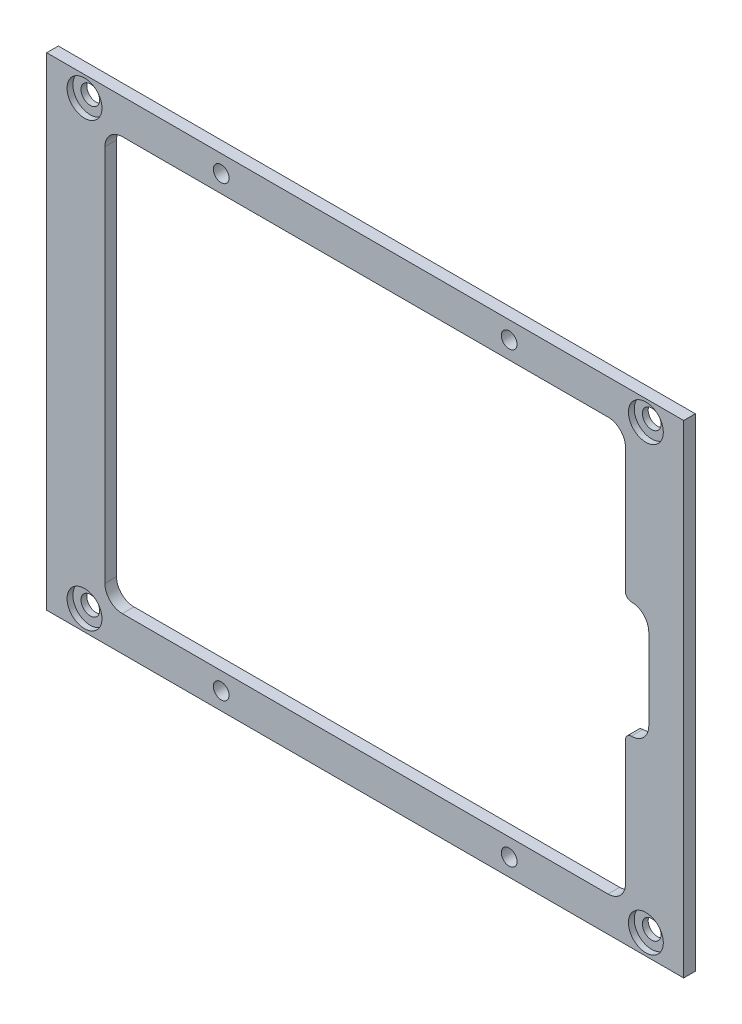
ISO-10303-21;
HEADER;
FILE_DESCRIPTION(('STEP AP214'),'2;1');
FILE_NAME('part.step','',(''),(''),'','','');
FILE_SCHEMA(('AUTOMOTIVE_DESIGN { 1 0 10303 214 1 1 1 1 }'));
ENDSEC;
DATA;
#1=APPLICATION_CONTEXT('core data for automotive mechanical design processes');
#2=APPLICATION_PROTOCOL_DEFINITION('international standard','automotive_design',2000,#1);
#3=PRODUCT_CONTEXT('',#1,'mechanical');
#4=PRODUCT('Part','Part','',(#3));
#5=PRODUCT_RELATED_PRODUCT_CATEGORY('part','',(#4));
#6=PRODUCT_DEFINITION_FORMATION('','',#4);
#7=PRODUCT_DEFINITION_CONTEXT('part definition',#1,'design');
#8=PRODUCT_DEFINITION('design','',#6,#7);
#9=PRODUCT_DEFINITION_SHAPE('','',#8);
#10=(LENGTH_UNIT() NAMED_UNIT(*) SI_UNIT(.MILLI.,.METRE.));
#11=(NAMED_UNIT(*) PLANE_ANGLE_UNIT() SI_UNIT($,.RADIAN.));
#12=(NAMED_UNIT(*) SI_UNIT($,.STERADIAN.) SOLID_ANGLE_UNIT());
#13=UNCERTAINTY_MEASURE_WITH_UNIT(LENGTH_MEASURE(1.E-05),#10,'distance_accuracy_value','');
#14=(GEOMETRIC_REPRESENTATION_CONTEXT(3) GLOBAL_UNCERTAINTY_ASSIGNED_CONTEXT((#13)) GLOBAL_UNIT_ASSIGNED_CONTEXT((#10,
#11,#12)) REPRESENTATION_CONTEXT('',''));
#15=CARTESIAN_POINT('',(0.,0.,0.));
#16=DIRECTION('',(0.,0.,1.));
#17=DIRECTION('',(1.,0.,0.));
#18=AXIS2_PLACEMENT_3D('',#15,#16,#17);
#19=CARTESIAN_POINT('',(-48.993641501856,6.95185693007487,9.43465612004684));
#20=DIRECTION('',(0.,0.,1.));
#21=DIRECTION('',(1.,0.,0.));
#22=AXIS2_PLACEMENT_3D('',#19,#20,#21);
#23=CYLINDRICAL_SURFACE('',#22,1.59999999999999);
#24=CARTESIAN_POINT('',(-48.993641501856,6.95185693007487,7.43465612004684));
#25=DIRECTION('',(0.,0.,-1.));
#26=DIRECTION('',(-1.,0.,0.));
#27=AXIS2_PLACEMENT_3D('',#24,#25,#26);
#28=CIRCLE('',#27,1.59999999999999);
#29=CARTESIAN_POINT('',(-50.593641501856,6.95185693007487,7.43465612004684));
#30=VERTEX_POINT('',#29);
#31=EDGE_CURVE('E705',#30,#30,#28,.T.);
#32=ORIENTED_EDGE('',*,*,#31,.T.);
#33=EDGE_LOOP('',(#32));
#34=FACE_BOUND('',#33,.T.);
#35=CARTESIAN_POINT('',(-48.993641501856,6.95185693007487,8.43465612004684));
#36=DIRECTION('',(0.,0.,1.));
#37=DIRECTION('',(1.,0.,0.));
#38=AXIS2_PLACEMENT_3D('',#35,#36,#37);
#39=CIRCLE('',#38,1.59999999999999);
#40=CARTESIAN_POINT('',(-47.393641501856,6.95185693007487,8.43465612004684));
#41=VERTEX_POINT('',#40);
#42=EDGE_CURVE('E290',#41,#41,#39,.F.);
#43=ORIENTED_EDGE('',*,*,#42,.F.);
#44=EDGE_LOOP('',(#43));
#45=FACE_BOUND('',#44,.T.);
#46=ADVANCED_FACE('F35',(#34,#45),#23,.F.);
#47=CARTESIAN_POINT('',(47.506358498144,6.95185693007488,9.43465612004684));
#48=DIRECTION('',(0.,0.,1.));
#49=DIRECTION('',(1.,0.,0.));
#50=AXIS2_PLACEMENT_3D('',#47,#48,#49);
#51=CYLINDRICAL_SURFACE('',#50,1.59999999999999);
#52=CARTESIAN_POINT('',(47.506358498144,6.95185693007488,7.43465612004684));
#53=DIRECTION('',(0.,0.,-1.));
#54=DIRECTION('',(-1.,0.,0.));
#55=AXIS2_PLACEMENT_3D('',#52,#53,#54);
#56=CIRCLE('',#55,1.59999999999999);
#57=CARTESIAN_POINT('',(45.906358498144,6.95185693007488,7.43465612004684));
#58=VERTEX_POINT('',#57);
#59=EDGE_CURVE('E208',#58,#58,#56,.T.);
#60=ORIENTED_EDGE('',*,*,#59,.T.);
#61=EDGE_LOOP('',(#60));
#62=FACE_BOUND('',#61,.T.);
#63=CARTESIAN_POINT('',(47.506358498144,6.95185693007488,8.43465612004684));
#64=DIRECTION('',(0.,0.,1.));
#65=DIRECTION('',(1.,0.,0.));
#66=AXIS2_PLACEMENT_3D('',#63,#64,#65);
#67=CIRCLE('',#66,1.59999999999999);
#68=CARTESIAN_POINT('',(49.106358498144,6.95185693007488,8.43465612004684));
#69=VERTEX_POINT('',#68);
#70=EDGE_CURVE('E285',#69,#69,#67,.F.);
#71=ORIENTED_EDGE('',*,*,#70,.F.);
#72=EDGE_LOOP('',(#71));
#73=FACE_BOUND('',#72,.T.);
#74=ADVANCED_FACE('F351',(#62,#73),#51,.F.);
#75=CARTESIAN_POINT('',(47.506358498144,82.9518569300749,9.43465612004684));
#76=DIRECTION('',(0.,0.,1.));
#77=DIRECTION('',(1.,0.,0.));
#78=AXIS2_PLACEMENT_3D('',#75,#76,#77);
#79=CYLINDRICAL_SURFACE('',#78,1.59999999999999);
#80=CARTESIAN_POINT('',(47.506358498144,82.9518569300749,7.43465612004684));
#81=DIRECTION('',(0.,0.,-1.));
#82=DIRECTION('',(-1.,0.,0.));
#83=AXIS2_PLACEMENT_3D('',#80,#81,#82);
#84=CIRCLE('',#83,1.59999999999999);
#85=CARTESIAN_POINT('',(45.906358498144,82.9518569300749,7.43465612004684));
#86=VERTEX_POINT('',#85);
#87=EDGE_CURVE('E715',#86,#86,#84,.T.);
#88=ORIENTED_EDGE('',*,*,#87,.T.);
#89=EDGE_LOOP('',(#88));
#90=FACE_BOUND('',#89,.T.);
#91=CARTESIAN_POINT('',(47.506358498144,82.9518569300749,8.43465612004684));
#92=DIRECTION('',(0.,0.,1.));
#93=DIRECTION('',(1.,0.,0.));
#94=AXIS2_PLACEMENT_3D('',#91,#92,#93);
#95=CIRCLE('',#94,1.59999999999999);
#96=CARTESIAN_POINT('',(49.106358498144,82.9518569300749,8.43465612004684));
#97=VERTEX_POINT('',#96);
#98=EDGE_CURVE('E280',#97,#97,#95,.F.);
#99=ORIENTED_EDGE('',*,*,#98,.F.);
#100=EDGE_LOOP('',(#99));
#101=FACE_BOUND('',#100,.T.);
#102=ADVANCED_FACE('F357',(#90,#101),#79,.F.);
#103=CARTESIAN_POINT('',(-48.993641501856,82.9518569300749,9.43465612004684));
#104=DIRECTION('',(0.,0.,1.));
#105=DIRECTION('',(1.,0.,0.));
#106=AXIS2_PLACEMENT_3D('',#103,#104,#105);
#107=CYLINDRICAL_SURFACE('',#106,1.59999999999999);
#108=CARTESIAN_POINT('',(-48.993641501856,82.9518569300749,7.43465612004684));
#109=DIRECTION('',(0.,0.,-1.));
#110=DIRECTION('',(-1.,0.,0.));
#111=AXIS2_PLACEMENT_3D('',#108,#109,#110);
#112=CIRCLE('',#111,1.59999999999999);
#113=CARTESIAN_POINT('',(-50.593641501856,82.9518569300749,7.43465612004684));
#114=VERTEX_POINT('',#113);
#115=EDGE_CURVE('E707',#114,#114,#112,.T.);
#116=ORIENTED_EDGE('',*,*,#115,.T.);
#117=EDGE_LOOP('',(#116));
#118=FACE_BOUND('',#117,.T.);
#119=CARTESIAN_POINT('',(-48.993641501856,82.9518569300749,8.43465612004684));
#120=DIRECTION('',(0.,0.,1.));
#121=DIRECTION('',(1.,0.,0.));
#122=AXIS2_PLACEMENT_3D('',#119,#120,#121);
#123=CIRCLE('',#122,1.59999999999999);
#124=CARTESIAN_POINT('',(-47.393641501856,82.9518569300749,8.43465612004684));
#125=VERTEX_POINT('',#124);
#126=EDGE_CURVE('E275',#125,#125,#123,.F.);
#127=ORIENTED_EDGE('',*,*,#126,.F.);
#128=EDGE_LOOP('',(#127));
#129=FACE_BOUND('',#128,.T.);
#130=ADVANCED_FACE('F366',(#118,#129),#107,.F.);
#131=CARTESIAN_POINT('',(-55.493641501856,86.4518569300749,9.43465612004684));
#132=DIRECTION('',(0.,0.,-1.));
#133=DIRECTION('',(-1.,0.,0.));
#134=AXIS2_PLACEMENT_3D('',#131,#132,#133);
#135=PLANE('',#134);
#136=CARTESIAN_POINT('',(-48.993641501856,6.95185693007487,9.43465612004684));
#137=DIRECTION('',(0.,0.,1.));
#138=DIRECTION('',(1.,0.,0.));
#139=AXIS2_PLACEMENT_3D('',#136,#137,#138);
#140=CIRCLE('',#139,3.);
#141=CARTESIAN_POINT('',(-45.993641501856,6.95185693007487,9.43465612004684));
#142=VERTEX_POINT('',#141);
#143=EDGE_CURVE('E773',#142,#142,#140,.T.);
#144=ORIENTED_EDGE('',*,*,#143,.F.);
#145=EDGE_LOOP('',(#144));
#146=FACE_BOUND('',#145,.T.);
#147=CARTESIAN_POINT('',(47.506358498144,6.95185693007488,9.43465612004684));
#148=DIRECTION('',(0.,0.,1.));
#149=DIRECTION('',(1.,0.,0.));
#150=AXIS2_PLACEMENT_3D('',#147,#148,#149);
#151=CIRCLE('',#150,3.);
#152=CARTESIAN_POINT('',(50.506358498144,6.95185693007488,9.43465612004684));
#153=VERTEX_POINT('',#152);
#154=EDGE_CURVE('E293',#153,#153,#151,.T.);
#155=ORIENTED_EDGE('',*,*,#154,.F.);
#156=EDGE_LOOP('',(#155));
#157=FACE_BOUND('',#156,.T.);
#158=CARTESIAN_POINT('',(47.506358498144,82.9518569300749,9.43465612004684));
#159=DIRECTION('',(0.,0.,1.));
#160=DIRECTION('',(1.,0.,0.));
#161=AXIS2_PLACEMENT_3D('',#158,#159,#160);
#162=CIRCLE('',#161,3.);
#163=CARTESIAN_POINT('',(50.506358498144,82.9518569300749,9.43465612004684));
#164=VERTEX_POINT('',#163);
#165=EDGE_CURVE('E288',#164,#164,#162,.T.);
#166=ORIENTED_EDGE('',*,*,#165,.F.);
#167=EDGE_LOOP('',(#166));
#168=FACE_BOUND('',#167,.T.);
#169=CARTESIAN_POINT('',(-48.993641501856,82.9518569300749,9.43465612004684));
#170=DIRECTION('',(0.,0.,1.));
#171=DIRECTION('',(1.,0.,0.));
#172=AXIS2_PLACEMENT_3D('',#169,#170,#171);
#173=CIRCLE('',#172,3.);
#174=CARTESIAN_POINT('',(-45.993641501856,82.9518569300749,9.43465612004684));
#175=VERTEX_POINT('',#174);
#176=EDGE_CURVE('E283',#175,#175,#173,.T.);
#177=ORIENTED_EDGE('',*,*,#176,.F.);
#178=EDGE_LOOP('',(#177));
#179=FACE_BOUND('',#178,.T.);
#180=CARTESIAN_POINT('',(24.006358498144,83.4518569300749,9.43465612004684));
#181=DIRECTION('',(0.,0.,1.));
#182=DIRECTION('',(1.,0.,0.));
#183=AXIS2_PLACEMENT_3D('',#180,#181,#182);
#184=CIRCLE('',#183,1.35);
#185=CARTESIAN_POINT('',(25.356358498144,83.4518569300749,9.43465612004684));
#186=VERTEX_POINT('',#185);
#187=EDGE_CURVE('E753',#186,#186,#184,.T.);
#188=ORIENTED_EDGE('',*,*,#187,.F.);
#189=EDGE_LOOP('',(#188));
#190=FACE_BOUND('',#189,.T.);
#191=CARTESIAN_POINT('',(-25.493641501856,6.45185693007488,9.43465612004684));
#192=DIRECTION('',(0.,0.,1.));
#193=DIRECTION('',(1.,0.,0.));
#194=AXIS2_PLACEMENT_3D('',#191,#192,#193);
#195=CIRCLE('',#194,1.35);
#196=CARTESIAN_POINT('',(-24.143641501856,6.45185693007488,9.43465612004684));
#197=VERTEX_POINT('',#196);
#198=EDGE_CURVE('E700',#197,#197,#195,.T.);
#199=ORIENTED_EDGE('',*,*,#198,.F.);
#200=EDGE_LOOP('',(#199));
#201=FACE_BOUND('',#200,.T.);
#202=DIRECTION('',(0.,-1.,0.));
#203=VECTOR('',#202,1.);
#204=CARTESIAN_POINT('',(-55.493641501856,3.45185693007487,9.43465612004684));
#205=LINE('',#204,#203);
#206=CARTESIAN_POINT('',(-55.493641501856,86.4518569300749,9.43465612004684));
#207=VERTEX_POINT('',#206);
#208=CARTESIAN_POINT('',(-55.493641501856,3.45185693007487,9.43465612004684));
#209=VERTEX_POINT('',#208);
#210=EDGE_CURVE('E245',#207,#209,#205,.T.);
#211=ORIENTED_EDGE('',*,*,#210,.T.);
#212=DIRECTION('',(1.,0.,0.));
#213=VECTOR('',#212,1.);
#214=CARTESIAN_POINT('',(-55.493641501856,3.45185693007487,9.43465612004684));
#215=LINE('',#214,#213);
#216=CARTESIAN_POINT('',(54.006358498144,3.45185693007489,9.43465612004684));
#217=VERTEX_POINT('',#216);
#218=EDGE_CURVE('E248',#209,#217,#215,.T.);
#219=ORIENTED_EDGE('',*,*,#218,.T.);
#220=DIRECTION('',(0.,1.,0.));
#221=VECTOR('',#220,1.);
#222=CARTESIAN_POINT('',(54.006358498144,3.45185693007489,9.43465612004684));
#223=LINE('',#222,#221);
#224=CARTESIAN_POINT('',(54.006358498144,86.4518569300749,9.43465612004684));
#225=VERTEX_POINT('',#224);
#226=EDGE_CURVE('E251',#217,#225,#223,.T.);
#227=ORIENTED_EDGE('',*,*,#226,.T.);
#228=DIRECTION('',(-1.,0.,0.));
#229=VECTOR('',#228,1.);
#230=CARTESIAN_POINT('',(-55.493641501856,86.4518569300749,9.43465612004684));
#231=LINE('',#230,#229);
#232=EDGE_CURVE('E253',#225,#207,#231,.T.);
#233=ORIENTED_EDGE('',*,*,#232,.T.);
#234=EDGE_LOOP('',(#211,#219,#227,#233));
#235=FACE_BOUND('',#234,.T.);
#236=CARTESIAN_POINT('',(45.006358498144,37.9518569300749,9.43465612004684));
#237=DIRECTION('',(0.,0.,-1.));
#238=DIRECTION('',(-1.,0.,0.));
#239=AXIS2_PLACEMENT_3D('',#236,#237,#238);
#240=CIRCLE('',#239,3.);
#241=CARTESIAN_POINT('',(48.006358498144,37.9518569300749,9.43465612004684));
#242=VERTEX_POINT('',#241);
#243=CARTESIAN_POINT('',(45.006358498144,34.9518569300749,9.43465612004684));
#244=VERTEX_POINT('',#243);
#245=EDGE_CURVE('E307',#242,#244,#240,.T.);
#246=ORIENTED_EDGE('',*,*,#245,.T.);
#247=CARTESIAN_POINT('',(45.006358498144,33.9518569300749,9.43465612004684));
#248=DIRECTION('',(0.,0.,-1.));
#249=DIRECTION('',(-1.,0.,0.));
#250=AXIS2_PLACEMENT_3D('',#247,#248,#249);
#251=CIRCLE('',#250,1.);
#252=CARTESIAN_POINT('',(44.006358498144,33.9518569300749,9.43465612004684));
#253=VERTEX_POINT('',#252);
#254=EDGE_CURVE('E43',#244,#253,#251,.F.);
#255=ORIENTED_EDGE('',*,*,#254,.T.);
#256=DIRECTION('',(0.,1.,0.));
#257=VECTOR('',#256,1.);
#258=CARTESIAN_POINT('',(44.006358498144,34.9518569300749,9.43465612004684));
#259=LINE('',#258,#257);
#260=CARTESIAN_POINT('',(44.006358498144,12.4518569300749,9.43465612004684));
#261=VERTEX_POINT('',#260);
#262=EDGE_CURVE('E186',#261,#253,#259,.T.);
#263=ORIENTED_EDGE('',*,*,#262,.F.);
#264=CARTESIAN_POINT('',(41.006358498144,12.4518569300749,9.43465612004684));
#265=DIRECTION('',(0.,0.,1.));
#266=DIRECTION('',(1.,0.,0.));
#267=AXIS2_PLACEMENT_3D('',#264,#265,#266);
#268=CIRCLE('',#267,3.);
#269=CARTESIAN_POINT('',(41.006358498144,9.45185693007489,9.43465612004684));
#270=VERTEX_POINT('',#269);
#271=EDGE_CURVE('E184',#270,#261,#268,.T.);
#272=ORIENTED_EDGE('',*,*,#271,.F.);
#273=DIRECTION('',(1.,0.,0.));
#274=VECTOR('',#273,1.);
#275=CARTESIAN_POINT('',(-42.493641501856,9.45185693007489,9.43465612004684));
#276=LINE('',#275,#274);
#277=CARTESIAN_POINT('',(-42.493641501856,9.45185693007489,9.43465612004684));
#278=VERTEX_POINT('',#277);
#279=EDGE_CURVE('E169',#278,#270,#276,.T.);
#280=ORIENTED_EDGE('',*,*,#279,.F.);
#281=CARTESIAN_POINT('',(-42.493641501856,12.4518569300749,9.43465612004684));
#282=DIRECTION('',(0.,0.,1.));
#283=DIRECTION('',(1.,0.,0.));
#284=AXIS2_PLACEMENT_3D('',#281,#282,#283);
#285=CIRCLE('',#284,3.);
#286=CARTESIAN_POINT('',(-45.493641501856,12.4518569300749,9.43465612004684));
#287=VERTEX_POINT('',#286);
#288=EDGE_CURVE('E159',#287,#278,#285,.T.);
#289=ORIENTED_EDGE('',*,*,#288,.F.);
#290=DIRECTION('',(0.,-1.,0.));
#291=VECTOR('',#290,1.);
#292=CARTESIAN_POINT('',(-45.493641501856,77.4518569300749,9.43465612004684));
#293=LINE('',#292,#291);
#294=CARTESIAN_POINT('',(-45.493641501856,77.4518569300749,9.43465612004684));
#295=VERTEX_POINT('',#294);
#296=EDGE_CURVE('E204',#295,#287,#293,.T.);
#297=ORIENTED_EDGE('',*,*,#296,.F.);
#298=CARTESIAN_POINT('',(-42.493641501856,77.4518569300749,9.43465612004684));
#299=DIRECTION('',(0.,0.,1.));
#300=DIRECTION('',(1.,0.,0.));
#301=AXIS2_PLACEMENT_3D('',#298,#299,#300);
#302=CIRCLE('',#301,3.);
#303=CARTESIAN_POINT('',(-42.493641501856,80.4518569300749,9.43465612004684));
#304=VERTEX_POINT('',#303);
#305=EDGE_CURVE('E201',#304,#295,#302,.T.);
#306=ORIENTED_EDGE('',*,*,#305,.F.);
#307=DIRECTION('',(-1.,0.,0.));
#308=VECTOR('',#307,1.);
#309=CARTESIAN_POINT('',(-42.493641501856,80.4518569300749,9.43465612004684));
#310=LINE('',#309,#308);
#311=CARTESIAN_POINT('',(41.006358498144,80.4518569300749,9.43465612004684));
#312=VERTEX_POINT('',#311);
#313=EDGE_CURVE('E199',#312,#304,#310,.T.);
#314=ORIENTED_EDGE('',*,*,#313,.F.);
#315=CARTESIAN_POINT('',(41.006358498144,77.4518569300749,9.43465612004684));
#316=DIRECTION('',(0.,0.,1.));
#317=DIRECTION('',(-1.,0.,0.));
#318=AXIS2_PLACEMENT_3D('',#315,#316,#317);
#319=CIRCLE('',#318,3.);
#320=CARTESIAN_POINT('',(44.006358498144,77.4518569300749,9.43465612004684));
#321=VERTEX_POINT('',#320);
#322=EDGE_CURVE('E197',#321,#312,#319,.T.);
#323=ORIENTED_EDGE('',*,*,#322,.F.);
#324=DIRECTION('',(0.,1.,0.));
#325=VECTOR('',#324,1.);
#326=CARTESIAN_POINT('',(44.006358498144,77.4518569300749,9.43465612004684));
#327=LINE('',#326,#325);
#328=CARTESIAN_POINT('',(44.006358498144,55.9518569300749,9.43465612004684));
#329=VERTEX_POINT('',#328);
#330=EDGE_CURVE('E195',#329,#321,#327,.T.);
#331=ORIENTED_EDGE('',*,*,#330,.F.);
#332=CARTESIAN_POINT('',(45.006358498144,55.9518569300749,9.43465612004684));
#333=DIRECTION('',(0.,0.,-1.));
#334=DIRECTION('',(-1.,0.,0.));
#335=AXIS2_PLACEMENT_3D('',#332,#333,#334);
#336=CIRCLE('',#335,1.);
#337=CARTESIAN_POINT('',(45.006358498144,54.9518569300749,9.43465612004684));
#338=VERTEX_POINT('',#337);
#339=EDGE_CURVE('E319',#329,#338,#336,.F.);
#340=ORIENTED_EDGE('',*,*,#339,.T.);
#341=CARTESIAN_POINT('',(45.006358498144,51.9518569300749,9.43465612004684));
#342=DIRECTION('',(0.,0.,-1.));
#343=DIRECTION('',(-1.,0.,0.));
#344=AXIS2_PLACEMENT_3D('',#341,#342,#343);
#345=CIRCLE('',#344,3.);
#346=CARTESIAN_POINT('',(48.006358498144,51.9518569300749,9.43465612004684));
#347=VERTEX_POINT('',#346);
#348=EDGE_CURVE('E311',#338,#347,#345,.T.);
#349=ORIENTED_EDGE('',*,*,#348,.T.);
#350=DIRECTION('',(0.,1.,0.));
#351=VECTOR('',#350,1.);
#352=CARTESIAN_POINT('',(48.006358498144,44.9518569300749,9.43465612004684));
#353=LINE('',#352,#351);
#354=EDGE_CURVE('E192',#242,#347,#353,.T.);
#355=ORIENTED_EDGE('',*,*,#354,.F.);
#356=EDGE_LOOP('',(#246,#255,#263,#272,#280,#289,#297,#306,#314,#323,#331,#340,#349,#355));
#357=FACE_BOUND('',#356,.T.);
#358=CARTESIAN_POINT('',(24.006358498144,6.45185693007489,9.43465612004684));
#359=DIRECTION('',(0.,0.,1.));
#360=DIRECTION('',(1.,0.,0.));
#361=AXIS2_PLACEMENT_3D('',#358,#359,#360);
#362=CIRCLE('',#361,1.35);
#363=CARTESIAN_POINT('',(25.356358498144,6.45185693007489,9.43465612004684));
#364=VERTEX_POINT('',#363);
#365=EDGE_CURVE('E747',#364,#364,#362,.T.);
#366=ORIENTED_EDGE('',*,*,#365,.F.);
#367=EDGE_LOOP('',(#366));
#368=FACE_BOUND('',#367,.T.);
#369=CARTESIAN_POINT('',(-25.493641501856,83.4518569300749,9.43465612004684));
#370=DIRECTION('',(0.,0.,1.));
#371=DIRECTION('',(1.,0.,0.));
#372=AXIS2_PLACEMENT_3D('',#369,#370,#371);
#373=CIRCLE('',#372,1.35);
#374=CARTESIAN_POINT('',(-24.143641501856,83.4518569300749,9.43465612004684));
#375=VERTEX_POINT('',#374);
#376=EDGE_CURVE('E278',#375,#375,#373,.T.);
#377=ORIENTED_EDGE('',*,*,#376,.F.);
#378=EDGE_LOOP('',(#377));
#379=FACE_BOUND('',#378,.T.);
#380=ADVANCED_FACE('F181',(#146,#157,#168,#179,#190,#201,#235,#357,#368,#379),#135,.F.);
#381=CARTESIAN_POINT('',(-55.493641501856,86.4518569300749,7.43465612004684));
#382=DIRECTION('',(0.,0.,-1.));
#383=DIRECTION('',(-1.,0.,0.));
#384=AXIS2_PLACEMENT_3D('',#381,#382,#383);
#385=PLANE('',#384);
#386=CARTESIAN_POINT('',(-25.493641501856,83.4518569300749,7.43465612004684));
#387=DIRECTION('',(0.,0.,-1.));
#388=DIRECTION('',(-1.,0.,0.));
#389=AXIS2_PLACEMENT_3D('',#386,#387,#388);
#390=CIRCLE('',#389,1.35);
#391=CARTESIAN_POINT('',(-26.843641501856,83.4518569300749,7.43465612004684));
#392=VERTEX_POINT('',#391);
#393=EDGE_CURVE('E756',#392,#392,#390,.T.);
#394=ORIENTED_EDGE('',*,*,#393,.F.);
#395=EDGE_LOOP('',(#394));
#396=FACE_BOUND('',#395,.T.);
#397=CARTESIAN_POINT('',(24.006358498144,83.4518569300749,7.43465612004684));
#398=DIRECTION('',(0.,0.,-1.));
#399=DIRECTION('',(-1.,0.,0.));
#400=AXIS2_PLACEMENT_3D('',#397,#398,#399);
#401=CIRCLE('',#400,1.35);
#402=CARTESIAN_POINT('',(22.656358498144,83.4518569300749,7.43465612004684));
#403=VERTEX_POINT('',#402);
#404=EDGE_CURVE('E750',#403,#403,#401,.T.);
#405=ORIENTED_EDGE('',*,*,#404,.F.);
#406=EDGE_LOOP('',(#405));
#407=FACE_BOUND('',#406,.T.);
#408=CARTESIAN_POINT('',(24.006358498144,6.45185693007489,7.43465612004684));
#409=DIRECTION('',(0.,0.,-1.));
#410=DIRECTION('',(-1.,0.,0.));
#411=AXIS2_PLACEMENT_3D('',#408,#409,#410);
#412=CIRCLE('',#411,1.35);
#413=CARTESIAN_POINT('',(22.656358498144,6.45185693007489,7.43465612004684));
#414=VERTEX_POINT('',#413);
#415=EDGE_CURVE('E709',#414,#414,#412,.T.);
#416=ORIENTED_EDGE('',*,*,#415,.F.);
#417=EDGE_LOOP('',(#416));
#418=FACE_BOUND('',#417,.T.);
#419=CARTESIAN_POINT('',(-25.493641501856,6.45185693007488,7.43465612004684));
#420=DIRECTION('',(0.,0.,-1.));
#421=DIRECTION('',(-1.,0.,0.));
#422=AXIS2_PLACEMENT_3D('',#419,#420,#421);
#423=CIRCLE('',#422,1.35);
#424=CARTESIAN_POINT('',(-26.843641501856,6.45185693007488,7.43465612004684));
#425=VERTEX_POINT('',#424);
#426=EDGE_CURVE('E703',#425,#425,#423,.T.);
#427=ORIENTED_EDGE('',*,*,#426,.F.);
#428=EDGE_LOOP('',(#427));
#429=FACE_BOUND('',#428,.T.);
#430=ORIENTED_EDGE('',*,*,#31,.F.);
#431=EDGE_LOOP('',(#430));
#432=FACE_BOUND('',#431,.T.);
#433=ORIENTED_EDGE('',*,*,#115,.F.);
#434=EDGE_LOOP('',(#433));
#435=FACE_BOUND('',#434,.T.);
#436=ORIENTED_EDGE('',*,*,#87,.F.);
#437=EDGE_LOOP('',(#436));
#438=FACE_BOUND('',#437,.T.);
#439=ORIENTED_EDGE('',*,*,#59,.F.);
#440=EDGE_LOOP('',(#439));
#441=FACE_BOUND('',#440,.T.);
#442=DIRECTION('',(0.,-1.,0.));
#443=VECTOR('',#442,1.);
#444=CARTESIAN_POINT('',(-55.493641501856,3.45185693007487,7.43465612004684));
#445=LINE('',#444,#443);
#446=CARTESIAN_POINT('',(-55.493641501856,86.4518569300749,7.43465612004684));
#447=VERTEX_POINT('',#446);
#448=CARTESIAN_POINT('',(-55.493641501856,3.45185693007487,7.43465612004684));
#449=VERTEX_POINT('',#448);
#450=EDGE_CURVE('E177',#447,#449,#445,.T.);
#451=ORIENTED_EDGE('',*,*,#450,.F.);
#452=DIRECTION('',(-1.,0.,0.));
#453=VECTOR('',#452,1.);
#454=CARTESIAN_POINT('',(-55.493641501856,86.4518569300749,7.43465612004684));
#455=LINE('',#454,#453);
#456=CARTESIAN_POINT('',(54.006358498144,86.4518569300749,7.43465612004684));
#457=VERTEX_POINT('',#456);
#458=EDGE_CURVE('E249',#457,#447,#455,.T.);
#459=ORIENTED_EDGE('',*,*,#458,.F.);
#460=DIRECTION('',(0.,1.,0.));
#461=VECTOR('',#460,1.);
#462=CARTESIAN_POINT('',(54.006358498144,3.45185693007489,7.43465612004684));
#463=LINE('',#462,#461);
#464=CARTESIAN_POINT('',(54.006358498144,3.45185693007489,7.43465612004684));
#465=VERTEX_POINT('',#464);
#466=EDGE_CURVE('E260',#465,#457,#463,.T.);
#467=ORIENTED_EDGE('',*,*,#466,.F.);
#468=DIRECTION('',(1.,0.,0.));
#469=VECTOR('',#468,1.);
#470=CARTESIAN_POINT('',(-55.493641501856,3.45185693007487,7.43465612004684));
#471=LINE('',#470,#469);
#472=EDGE_CURVE('E258',#449,#465,#471,.T.);
#473=ORIENTED_EDGE('',*,*,#472,.F.);
#474=EDGE_LOOP('',(#451,#459,#467,#473));
#475=FACE_BOUND('',#474,.T.);
#476=DIRECTION('',(0.,1.,0.));
#477=VECTOR('',#476,1.);
#478=CARTESIAN_POINT('',(44.006358498144,34.9518569300749,7.43465612004684));
#479=LINE('',#478,#477);
#480=CARTESIAN_POINT('',(44.006358498144,12.4518569300749,7.43465612004684));
#481=VERTEX_POINT('',#480);
#482=CARTESIAN_POINT('',(44.006358498144,33.9518569300749,7.43465612004684));
#483=VERTEX_POINT('',#482);
#484=EDGE_CURVE('E213',#481,#483,#479,.T.);
#485=ORIENTED_EDGE('',*,*,#484,.T.);
#486=CARTESIAN_POINT('',(45.006358498144,33.9518569300749,7.43465612004684));
#487=DIRECTION('',(0.,0.,-1.));
#488=DIRECTION('',(-1.,0.,0.));
#489=AXIS2_PLACEMENT_3D('',#486,#487,#488);
#490=CIRCLE('',#489,1.);
#491=CARTESIAN_POINT('',(45.006358498144,34.9518569300749,7.43465612004684));
#492=VERTEX_POINT('',#491);
#493=EDGE_CURVE('E317',#483,#492,#490,.T.);
#494=ORIENTED_EDGE('',*,*,#493,.T.);
#495=CARTESIAN_POINT('',(45.006358498144,37.9518569300749,7.43465612004684));
#496=DIRECTION('',(0.,0.,-1.));
#497=DIRECTION('',(-1.,0.,0.));
#498=AXIS2_PLACEMENT_3D('',#495,#496,#497);
#499=CIRCLE('',#498,3.);
#500=CARTESIAN_POINT('',(48.006358498144,37.9518569300749,7.43465612004684));
#501=VERTEX_POINT('',#500);
#502=EDGE_CURVE('E305',#492,#501,#499,.F.);
#503=ORIENTED_EDGE('',*,*,#502,.T.);
#504=DIRECTION('',(0.,1.,0.));
#505=VECTOR('',#504,1.);
#506=CARTESIAN_POINT('',(48.006358498144,54.9518569300749,7.43465612004684));
#507=LINE('',#506,#505);
#508=CARTESIAN_POINT('',(48.006358498144,51.9518569300749,7.43465612004684));
#509=VERTEX_POINT('',#508);
#510=EDGE_CURVE('E216',#501,#509,#507,.T.);
#511=ORIENTED_EDGE('',*,*,#510,.T.);
#512=CARTESIAN_POINT('',(45.006358498144,51.9518569300749,7.43465612004684));
#513=DIRECTION('',(0.,0.,-1.));
#514=DIRECTION('',(-1.,0.,0.));
#515=AXIS2_PLACEMENT_3D('',#512,#513,#514);
#516=CIRCLE('',#515,3.);
#517=CARTESIAN_POINT('',(45.006358498144,54.9518569300749,7.43465612004684));
#518=VERTEX_POINT('',#517);
#519=EDGE_CURVE('E309',#509,#518,#516,.F.);
#520=ORIENTED_EDGE('',*,*,#519,.T.);
#521=CARTESIAN_POINT('',(45.006358498144,55.9518569300749,7.43465612004684));
#522=DIRECTION('',(0.,0.,-1.));
#523=DIRECTION('',(-1.,0.,0.));
#524=AXIS2_PLACEMENT_3D('',#521,#522,#523);
#525=CIRCLE('',#524,1.);
#526=CARTESIAN_POINT('',(44.006358498144,55.9518569300749,7.43465612004684));
#527=VERTEX_POINT('',#526);
#528=EDGE_CURVE('E56',#518,#527,#525,.T.);
#529=ORIENTED_EDGE('',*,*,#528,.T.);
#530=DIRECTION('',(0.,1.,0.));
#531=VECTOR('',#530,1.);
#532=CARTESIAN_POINT('',(44.006358498144,77.4518569300749,7.43465612004684));
#533=LINE('',#532,#531);
#534=CARTESIAN_POINT('',(44.006358498144,77.4518569300749,7.43465612004684));
#535=VERTEX_POINT('',#534);
#536=EDGE_CURVE('E219',#527,#535,#533,.T.);
#537=ORIENTED_EDGE('',*,*,#536,.T.);
#538=CARTESIAN_POINT('',(41.006358498144,77.4518569300749,7.43465612004684));
#539=DIRECTION('',(0.,0.,1.));
#540=DIRECTION('',(-1.,0.,0.));
#541=AXIS2_PLACEMENT_3D('',#538,#539,#540);
#542=CIRCLE('',#541,3.);
#543=CARTESIAN_POINT('',(41.006358498144,80.4518569300749,7.43465612004684));
#544=VERTEX_POINT('',#543);
#545=EDGE_CURVE('E221',#535,#544,#542,.T.);
#546=ORIENTED_EDGE('',*,*,#545,.T.);
#547=DIRECTION('',(-1.,0.,0.));
#548=VECTOR('',#547,1.);
#549=CARTESIAN_POINT('',(-42.493641501856,80.4518569300749,7.43465612004684));
#550=LINE('',#549,#548);
#551=CARTESIAN_POINT('',(-42.493641501856,80.4518569300749,7.43465612004684));
#552=VERTEX_POINT('',#551);
#553=EDGE_CURVE('E224',#544,#552,#550,.T.);
#554=ORIENTED_EDGE('',*,*,#553,.T.);
#555=CARTESIAN_POINT('',(-42.493641501856,77.4518569300749,7.43465612004684));
#556=DIRECTION('',(0.,0.,1.));
#557=DIRECTION('',(1.,0.,0.));
#558=AXIS2_PLACEMENT_3D('',#555,#556,#557);
#559=CIRCLE('',#558,3.);
#560=CARTESIAN_POINT('',(-45.493641501856,77.4518569300749,7.43465612004684));
#561=VERTEX_POINT('',#560);
#562=EDGE_CURVE('E227',#552,#561,#559,.T.);
#563=ORIENTED_EDGE('',*,*,#562,.T.);
#564=DIRECTION('',(0.,-1.,0.));
#565=VECTOR('',#564,1.);
#566=CARTESIAN_POINT('',(-45.493641501856,77.4518569300749,7.43465612004684));
#567=LINE('',#566,#565);
#568=CARTESIAN_POINT('',(-45.493641501856,12.4518569300749,7.43465612004684));
#569=VERTEX_POINT('',#568);
#570=EDGE_CURVE('E170',#561,#569,#567,.T.);
#571=ORIENTED_EDGE('',*,*,#570,.T.);
#572=CARTESIAN_POINT('',(-42.493641501856,12.4518569300749,7.43465612004684));
#573=DIRECTION('',(0.,0.,1.));
#574=DIRECTION('',(1.,0.,0.));
#575=AXIS2_PLACEMENT_3D('',#572,#573,#574);
#576=CIRCLE('',#575,3.);
#577=CARTESIAN_POINT('',(-42.493641501856,9.45185693007489,7.43465612004684));
#578=VERTEX_POINT('',#577);
#579=EDGE_CURVE('E206',#569,#578,#576,.T.);
#580=ORIENTED_EDGE('',*,*,#579,.T.);
#581=DIRECTION('',(1.,0.,0.));
#582=VECTOR('',#581,1.);
#583=CARTESIAN_POINT('',(-42.493641501856,9.45185693007489,7.43465612004684));
#584=LINE('',#583,#582);
#585=CARTESIAN_POINT('',(41.006358498144,9.45185693007489,7.43465612004684));
#586=VERTEX_POINT('',#585);
#587=EDGE_CURVE('E176',#578,#586,#584,.T.);
#588=ORIENTED_EDGE('',*,*,#587,.T.);
#589=CARTESIAN_POINT('',(41.006358498144,12.4518569300749,7.43465612004684));
#590=DIRECTION('',(0.,0.,1.));
#591=DIRECTION('',(1.,0.,0.));
#592=AXIS2_PLACEMENT_3D('',#589,#590,#591);
#593=CIRCLE('',#592,3.);
#594=EDGE_CURVE('E210',#586,#481,#593,.T.);
#595=ORIENTED_EDGE('',*,*,#594,.T.);
#596=EDGE_LOOP('',(#485,#494,#503,#511,#520,#529,#537,#546,#554,#563,#571,#580,#588,#595));
#597=FACE_BOUND('',#596,.T.);
#598=ADVANCED_FACE('F332',(#396,#407,#418,#429,#432,#435,#438,#441,#475,#597),#385,.T.);
#599=CARTESIAN_POINT('',(-55.493641501856,3.45185693007487,9.43465612004684));
#600=DIRECTION('',(1.,0.,0.));
#601=DIRECTION('',(0.,0.,-1.));
#602=AXIS2_PLACEMENT_3D('',#599,#600,#601);
#603=PLANE('',#602);
#604=ORIENTED_EDGE('',*,*,#450,.T.);
#605=DIRECTION('',(0.,0.,-1.));
#606=VECTOR('',#605,1.);
#607=CARTESIAN_POINT('',(-55.493641501856,3.45185693007487,9.43465612004684));
#608=LINE('',#607,#606);
#609=EDGE_CURVE('E271',#209,#449,#608,.T.);
#610=ORIENTED_EDGE('',*,*,#609,.F.);
#611=ORIENTED_EDGE('',*,*,#210,.F.);
#612=DIRECTION('',(0.,0.,-1.));
#613=VECTOR('',#612,1.);
#614=CARTESIAN_POINT('',(-55.493641501856,86.4518569300749,9.43465612004684));
#615=LINE('',#614,#613);
#616=EDGE_CURVE('E255',#207,#447,#615,.T.);
#617=ORIENTED_EDGE('',*,*,#616,.T.);
#618=EDGE_LOOP('',(#604,#610,#611,#617));
#619=FACE_BOUND('',#618,.T.);
#620=ADVANCED_FACE('F410',(#619),#603,.F.);
#621=CARTESIAN_POINT('',(-55.493641501856,3.45185693007487,9.43465612004684));
#622=DIRECTION('',(0.,1.,0.));
#623=DIRECTION('',(-1.,0.,0.));
#624=AXIS2_PLACEMENT_3D('',#621,#622,#623);
#625=PLANE('',#624);
#626=ORIENTED_EDGE('',*,*,#472,.T.);
#627=DIRECTION('',(0.,0.,-1.));
#628=VECTOR('',#627,1.);
#629=CARTESIAN_POINT('',(54.006358498144,3.45185693007489,9.43465612004684));
#630=LINE('',#629,#628);
#631=EDGE_CURVE('E268',#217,#465,#630,.T.);
#632=ORIENTED_EDGE('',*,*,#631,.F.);
#633=ORIENTED_EDGE('',*,*,#218,.F.);
#634=ORIENTED_EDGE('',*,*,#609,.T.);
#635=EDGE_LOOP('',(#626,#632,#633,#634));
#636=FACE_BOUND('',#635,.T.);
#637=ADVANCED_FACE('F418',(#636),#625,.F.);
#638=CARTESIAN_POINT('',(54.006358498144,3.45185693007489,9.43465612004684));
#639=DIRECTION('',(-1.,0.,0.));
#640=DIRECTION('',(0.,0.,1.));
#641=AXIS2_PLACEMENT_3D('',#638,#639,#640);
#642=PLANE('',#641);
#643=ORIENTED_EDGE('',*,*,#466,.T.);
#644=DIRECTION('',(0.,0.,-1.));
#645=VECTOR('',#644,1.);
#646=CARTESIAN_POINT('',(54.006358498144,86.4518569300749,9.43465612004684));
#647=LINE('',#646,#645);
#648=EDGE_CURVE('E265',#225,#457,#647,.T.);
#649=ORIENTED_EDGE('',*,*,#648,.F.);
#650=ORIENTED_EDGE('',*,*,#226,.F.);
#651=ORIENTED_EDGE('',*,*,#631,.T.);
#652=EDGE_LOOP('',(#643,#649,#650,#651));
#653=FACE_BOUND('',#652,.T.);
#654=ADVANCED_FACE('F414',(#653),#642,.F.);
#655=CARTESIAN_POINT('',(-55.493641501856,86.4518569300749,9.43465612004684));
#656=DIRECTION('',(0.,-1.,0.));
#657=DIRECTION('',(0.,0.,-1.));
#658=AXIS2_PLACEMENT_3D('',#655,#656,#657);
#659=PLANE('',#658);
#660=ORIENTED_EDGE('',*,*,#458,.T.);
#661=ORIENTED_EDGE('',*,*,#616,.F.);
#662=ORIENTED_EDGE('',*,*,#232,.F.);
#663=ORIENTED_EDGE('',*,*,#648,.T.);
#664=EDGE_LOOP('',(#660,#661,#662,#663));
#665=FACE_BOUND('',#664,.T.);
#666=ADVANCED_FACE('F404',(#665),#659,.F.);
#667=CARTESIAN_POINT('',(-42.493641501856,12.4518569300749,9.43465612004684));
#668=DIRECTION('',(0.,0.,-1.));
#669=DIRECTION('',(-1.,0.,0.));
#670=AXIS2_PLACEMENT_3D('',#667,#668,#669);
#671=CYLINDRICAL_SURFACE('',#670,3.);
#672=ORIENTED_EDGE('',*,*,#579,.F.);
#673=DIRECTION('',(0.,0.,-1.));
#674=VECTOR('',#673,1.);
#675=CARTESIAN_POINT('',(-45.493641501856,12.4518569300749,9.43465612004684));
#676=LINE('',#675,#674);
#677=EDGE_CURVE('E165',#287,#569,#676,.T.);
#678=ORIENTED_EDGE('',*,*,#677,.F.);
#679=ORIENTED_EDGE('',*,*,#288,.T.);
#680=DIRECTION('',(0.,0.,-1.));
#681=VECTOR('',#680,1.);
#682=CARTESIAN_POINT('',(-42.493641501856,9.45185693007489,9.43465612004684));
#683=LINE('',#682,#681);
#684=EDGE_CURVE('E162',#278,#578,#683,.T.);
#685=ORIENTED_EDGE('',*,*,#684,.T.);
#686=EDGE_LOOP('',(#672,#678,#679,#685));
#687=FACE_BOUND('',#686,.T.);
#688=ADVANCED_FACE('F161',(#687),#671,.F.);
#689=CARTESIAN_POINT('',(-42.493641501856,9.45185693007489,9.43465612004684));
#690=DIRECTION('',(0.,1.,0.));
#691=DIRECTION('',(0.,0.,1.));
#692=AXIS2_PLACEMENT_3D('',#689,#690,#691);
#693=PLANE('',#692);
#694=ORIENTED_EDGE('',*,*,#587,.F.);
#695=ORIENTED_EDGE('',*,*,#684,.F.);
#696=ORIENTED_EDGE('',*,*,#279,.T.);
#697=DIRECTION('',(0.,0.,-1.));
#698=VECTOR('',#697,1.);
#699=CARTESIAN_POINT('',(41.006358498144,9.45185693007489,9.43465612004684));
#700=LINE('',#699,#698);
#701=EDGE_CURVE('E178',#270,#586,#700,.T.);
#702=ORIENTED_EDGE('',*,*,#701,.T.);
#703=EDGE_LOOP('',(#694,#695,#696,#702));
#704=FACE_BOUND('',#703,.T.);
#705=ADVANCED_FACE('F173',(#704),#693,.T.);
#706=CARTESIAN_POINT('',(41.006358498144,12.4518569300749,9.43465612004684));
#707=DIRECTION('',(0.,0.,-1.));
#708=DIRECTION('',(-1.,0.,0.));
#709=AXIS2_PLACEMENT_3D('',#706,#707,#708);
#710=CYLINDRICAL_SURFACE('',#709,3.);
#711=ORIENTED_EDGE('',*,*,#594,.F.);
#712=ORIENTED_EDGE('',*,*,#701,.F.);
#713=ORIENTED_EDGE('',*,*,#271,.T.);
#714=DIRECTION('',(0.,0.,-1.));
#715=VECTOR('',#714,1.);
#716=CARTESIAN_POINT('',(44.006358498144,12.4518569300749,9.43465612004684));
#717=LINE('',#716,#715);
#718=EDGE_CURVE('E242',#261,#481,#717,.T.);
#719=ORIENTED_EDGE('',*,*,#718,.T.);
#720=EDGE_LOOP('',(#711,#712,#713,#719));
#721=FACE_BOUND('',#720,.T.);
#722=ADVANCED_FACE('F396',(#721),#710,.F.);
#723=CARTESIAN_POINT('',(44.006358498144,34.9518569300749,9.43465612004684));
#724=DIRECTION('',(-1.,0.,0.));
#725=DIRECTION('',(0.,-1.,0.));
#726=AXIS2_PLACEMENT_3D('',#723,#724,#725);
#727=PLANE('',#726);
#728=ORIENTED_EDGE('',*,*,#262,.T.);
#729=DIRECTION('',(0.,0.,-1.));
#730=VECTOR('',#729,1.);
#731=CARTESIAN_POINT('',(44.006358498144,33.9518569300749,9.43465612004684));
#732=LINE('',#731,#730);
#733=EDGE_CURVE('E313',#253,#483,#732,.T.);
#734=ORIENTED_EDGE('',*,*,#733,.T.);
#735=ORIENTED_EDGE('',*,*,#484,.F.);
#736=ORIENTED_EDGE('',*,*,#718,.F.);
#737=EDGE_LOOP('',(#728,#734,#735,#736));
#738=FACE_BOUND('',#737,.T.);
#739=ADVANCED_FACE('F328',(#738),#727,.T.);
#740=CARTESIAN_POINT('',(48.006358498144,54.9518569300749,9.43465612004684));
#741=DIRECTION('',(-1.,0.,0.));
#742=DIRECTION('',(0.,0.,1.));
#743=AXIS2_PLACEMENT_3D('',#740,#741,#742);
#744=PLANE('',#743);
#745=ORIENTED_EDGE('',*,*,#510,.F.);
#746=DIRECTION('',(0.,0.,-1.));
#747=VECTOR('',#746,1.);
#748=CARTESIAN_POINT('',(48.006358498144,37.9518569300749,9.43465612004684));
#749=LINE('',#748,#747);
#750=EDGE_CURVE('E300',#501,#242,#749,.F.);
#751=ORIENTED_EDGE('',*,*,#750,.T.);
#752=ORIENTED_EDGE('',*,*,#354,.T.);
#753=DIRECTION('',(0.,0.,-1.));
#754=VECTOR('',#753,1.);
#755=CARTESIAN_POINT('',(48.006358498144,51.9518569300749,7.43465612004684));
#756=LINE('',#755,#754);
#757=EDGE_CURVE('E297',#347,#509,#756,.T.);
#758=ORIENTED_EDGE('',*,*,#757,.T.);
#759=EDGE_LOOP('',(#745,#751,#752,#758));
#760=FACE_BOUND('',#759,.T.);
#761=ADVANCED_FACE('F338',(#760),#744,.T.);
#762=CARTESIAN_POINT('',(44.006358498144,77.4518569300749,9.43465612004684));
#763=DIRECTION('',(-1.,0.,0.));
#764=DIRECTION('',(0.,0.,1.));
#765=AXIS2_PLACEMENT_3D('',#762,#763,#764);
#766=PLANE('',#765);
#767=ORIENTED_EDGE('',*,*,#536,.F.);
#768=DIRECTION('',(0.,0.,-1.));
#769=VECTOR('',#768,1.);
#770=CARTESIAN_POINT('',(44.006358498144,55.9518569300749,9.43465612004684));
#771=LINE('',#770,#769);
#772=EDGE_CURVE('E11',#527,#329,#771,.F.);
#773=ORIENTED_EDGE('',*,*,#772,.T.);
#774=ORIENTED_EDGE('',*,*,#330,.T.);
#775=DIRECTION('',(0.,0.,-1.));
#776=VECTOR('',#775,1.);
#777=CARTESIAN_POINT('',(44.006358498144,77.4518569300749,9.43465612004684));
#778=LINE('',#777,#776);
#779=EDGE_CURVE('E239',#321,#535,#778,.T.);
#780=ORIENTED_EDGE('',*,*,#779,.T.);
#781=EDGE_LOOP('',(#767,#773,#774,#780));
#782=FACE_BOUND('',#781,.T.);
#783=ADVANCED_FACE('F388',(#782),#766,.T.);
#784=CARTESIAN_POINT('',(41.006358498144,77.4518569300749,9.43465612004684));
#785=DIRECTION('',(0.,0.,-1.));
#786=DIRECTION('',(-1.,0.,0.));
#787=AXIS2_PLACEMENT_3D('',#784,#785,#786);
#788=CYLINDRICAL_SURFACE('',#787,3.);
#789=ORIENTED_EDGE('',*,*,#545,.F.);
#790=ORIENTED_EDGE('',*,*,#779,.F.);
#791=ORIENTED_EDGE('',*,*,#322,.T.);
#792=DIRECTION('',(0.,0.,-1.));
#793=VECTOR('',#792,1.);
#794=CARTESIAN_POINT('',(41.006358498144,80.4518569300749,9.43465612004684));
#795=LINE('',#794,#793);
#796=EDGE_CURVE('E237',#312,#544,#795,.T.);
#797=ORIENTED_EDGE('',*,*,#796,.T.);
#798=EDGE_LOOP('',(#789,#790,#791,#797));
#799=FACE_BOUND('',#798,.T.);
#800=ADVANCED_FACE('F384',(#799),#788,.F.);
#801=CARTESIAN_POINT('',(-42.493641501856,80.4518569300749,9.43465612004684));
#802=DIRECTION('',(0.,-1.,0.));
#803=DIRECTION('',(0.,0.,-1.));
#804=AXIS2_PLACEMENT_3D('',#801,#802,#803);
#805=PLANE('',#804);
#806=ORIENTED_EDGE('',*,*,#553,.F.);
#807=ORIENTED_EDGE('',*,*,#796,.F.);
#808=ORIENTED_EDGE('',*,*,#313,.T.);
#809=DIRECTION('',(0.,0.,-1.));
#810=VECTOR('',#809,1.);
#811=CARTESIAN_POINT('',(-42.493641501856,80.4518569300749,9.43465612004684));
#812=LINE('',#811,#810);
#813=EDGE_CURVE('E235',#304,#552,#812,.T.);
#814=ORIENTED_EDGE('',*,*,#813,.T.);
#815=EDGE_LOOP('',(#806,#807,#808,#814));
#816=FACE_BOUND('',#815,.T.);
#817=ADVANCED_FACE('F380',(#816),#805,.T.);
#818=CARTESIAN_POINT('',(-42.493641501856,77.4518569300749,9.43465612004684));
#819=DIRECTION('',(0.,0.,-1.));
#820=DIRECTION('',(-1.,0.,0.));
#821=AXIS2_PLACEMENT_3D('',#818,#819,#820);
#822=CYLINDRICAL_SURFACE('',#821,3.);
#823=ORIENTED_EDGE('',*,*,#562,.F.);
#824=ORIENTED_EDGE('',*,*,#813,.F.);
#825=ORIENTED_EDGE('',*,*,#305,.T.);
#826=DIRECTION('',(0.,0.,-1.));
#827=VECTOR('',#826,1.);
#828=CARTESIAN_POINT('',(-45.493641501856,77.4518569300749,9.43465612004684));
#829=LINE('',#828,#827);
#830=EDGE_CURVE('E233',#295,#561,#829,.T.);
#831=ORIENTED_EDGE('',*,*,#830,.T.);
#832=EDGE_LOOP('',(#823,#824,#825,#831));
#833=FACE_BOUND('',#832,.T.);
#834=ADVANCED_FACE('F376',(#833),#822,.F.);
#835=CARTESIAN_POINT('',(-45.493641501856,77.4518569300749,9.43465612004684));
#836=DIRECTION('',(1.,0.,0.));
#837=DIRECTION('',(0.,1.,0.));
#838=AXIS2_PLACEMENT_3D('',#835,#836,#837);
#839=PLANE('',#838);
#840=ORIENTED_EDGE('',*,*,#570,.F.);
#841=ORIENTED_EDGE('',*,*,#830,.F.);
#842=ORIENTED_EDGE('',*,*,#296,.T.);
#843=ORIENTED_EDGE('',*,*,#677,.T.);
#844=EDGE_LOOP('',(#840,#841,#842,#843));
#845=FACE_BOUND('',#844,.T.);
#846=ADVANCED_FACE('F373',(#845),#839,.T.);
#847=CARTESIAN_POINT('',(-25.493641501856,6.45185693007488,9.43465612004684));
#848=DIRECTION('',(0.,0.,1.));
#849=DIRECTION('',(1.,0.,0.));
#850=AXIS2_PLACEMENT_3D('',#847,#848,#849);
#851=CYLINDRICAL_SURFACE('',#850,1.35);
#852=ORIENTED_EDGE('',*,*,#198,.T.);
#853=EDGE_LOOP('',(#852));
#854=FACE_BOUND('',#853,.T.);
#855=ORIENTED_EDGE('',*,*,#426,.T.);
#856=EDGE_LOOP('',(#855));
#857=FACE_BOUND('',#856,.T.);
#858=ADVANCED_FACE('F364',(#854,#857),#851,.F.);
#859=CARTESIAN_POINT('',(24.006358498144,6.45185693007489,9.43465612004684));
#860=DIRECTION('',(0.,0.,1.));
#861=DIRECTION('',(1.,0.,0.));
#862=AXIS2_PLACEMENT_3D('',#859,#860,#861);
#863=CYLINDRICAL_SURFACE('',#862,1.35);
#864=ORIENTED_EDGE('',*,*,#365,.T.);
#865=EDGE_LOOP('',(#864));
#866=FACE_BOUND('',#865,.T.);
#867=ORIENTED_EDGE('',*,*,#415,.T.);
#868=EDGE_LOOP('',(#867));
#869=FACE_BOUND('',#868,.T.);
#870=ADVANCED_FACE('F561',(#866,#869),#863,.F.);
#871=CARTESIAN_POINT('',(24.006358498144,83.4518569300749,9.43465612004684));
#872=DIRECTION('',(0.,0.,1.));
#873=DIRECTION('',(1.,0.,0.));
#874=AXIS2_PLACEMENT_3D('',#871,#872,#873);
#875=CYLINDRICAL_SURFACE('',#874,1.35);
#876=ORIENTED_EDGE('',*,*,#187,.T.);
#877=EDGE_LOOP('',(#876));
#878=FACE_BOUND('',#877,.T.);
#879=ORIENTED_EDGE('',*,*,#404,.T.);
#880=EDGE_LOOP('',(#879));
#881=FACE_BOUND('',#880,.T.);
#882=ADVANCED_FACE('F551',(#878,#881),#875,.F.);
#883=CARTESIAN_POINT('',(-25.493641501856,83.4518569300749,9.43465612004684));
#884=DIRECTION('',(0.,0.,1.));
#885=DIRECTION('',(1.,0.,0.));
#886=AXIS2_PLACEMENT_3D('',#883,#884,#885);
#887=CYLINDRICAL_SURFACE('',#886,1.35);
#888=ORIENTED_EDGE('',*,*,#376,.T.);
#889=EDGE_LOOP('',(#888));
#890=FACE_BOUND('',#889,.T.);
#891=ORIENTED_EDGE('',*,*,#393,.T.);
#892=EDGE_LOOP('',(#891));
#893=FACE_BOUND('',#892,.T.);
#894=ADVANCED_FACE('F523',(#890,#893),#887,.F.);
#895=CARTESIAN_POINT('',(-48.993641501856,82.9518569300749,8.43465612004684));
#896=DIRECTION('',(0.,0.,1.));
#897=DIRECTION('',(1.,0.,0.));
#898=AXIS2_PLACEMENT_3D('',#895,#896,#897);
#899=PLANE('',#898);
#900=CARTESIAN_POINT('',(-48.993641501856,82.9518569300749,8.43465612004684));
#901=DIRECTION('',(0.,0.,1.));
#902=DIRECTION('',(1.,0.,0.));
#903=AXIS2_PLACEMENT_3D('',#900,#901,#902);
#904=CIRCLE('',#903,3.);
#905=CARTESIAN_POINT('',(-45.993641501856,82.9518569300749,8.43465612004684));
#906=VERTEX_POINT('',#905);
#907=EDGE_CURVE('E279',#906,#906,#904,.T.);
#908=ORIENTED_EDGE('',*,*,#907,.T.);
#909=EDGE_LOOP('',(#908));
#910=FACE_BOUND('',#909,.T.);
#911=ORIENTED_EDGE('',*,*,#126,.T.);
#912=EDGE_LOOP('',(#911));
#913=FACE_BOUND('',#912,.T.);
#914=ADVANCED_FACE('F514',(#910,#913),#899,.T.);
#915=CARTESIAN_POINT('',(-48.993641501856,82.9518569300749,8.43465612004684));
#916=DIRECTION('',(0.,0.,1.));
#917=DIRECTION('',(1.,0.,0.));
#918=AXIS2_PLACEMENT_3D('',#915,#916,#917);
#919=CYLINDRICAL_SURFACE('',#918,3.);
#920=ORIENTED_EDGE('',*,*,#907,.F.);
#921=EDGE_LOOP('',(#920));
#922=FACE_BOUND('',#921,.T.);
#923=ORIENTED_EDGE('',*,*,#176,.T.);
#924=EDGE_LOOP('',(#923));
#925=FACE_BOUND('',#924,.T.);
#926=ADVANCED_FACE('F505',(#922,#925),#919,.F.);
#927=CARTESIAN_POINT('',(47.506358498144,82.9518569300749,8.43465612004684));
#928=DIRECTION('',(0.,0.,1.));
#929=DIRECTION('',(1.,0.,0.));
#930=AXIS2_PLACEMENT_3D('',#927,#928,#929);
#931=PLANE('',#930);
#932=CARTESIAN_POINT('',(47.506358498144,82.9518569300749,8.43465612004684));
#933=DIRECTION('',(0.,0.,1.));
#934=DIRECTION('',(1.,0.,0.));
#935=AXIS2_PLACEMENT_3D('',#932,#933,#934);
#936=CIRCLE('',#935,3.);
#937=CARTESIAN_POINT('',(50.506358498144,82.9518569300749,8.43465612004684));
#938=VERTEX_POINT('',#937);
#939=EDGE_CURVE('E284',#938,#938,#936,.T.);
#940=ORIENTED_EDGE('',*,*,#939,.T.);
#941=EDGE_LOOP('',(#940));
#942=FACE_BOUND('',#941,.T.);
#943=ORIENTED_EDGE('',*,*,#98,.T.);
#944=EDGE_LOOP('',(#943));
#945=FACE_BOUND('',#944,.T.);
#946=ADVANCED_FACE('F496',(#942,#945),#931,.T.);
#947=CARTESIAN_POINT('',(47.506358498144,82.9518569300749,8.43465612004684));
#948=DIRECTION('',(0.,0.,1.));
#949=DIRECTION('',(1.,0.,0.));
#950=AXIS2_PLACEMENT_3D('',#947,#948,#949);
#951=CYLINDRICAL_SURFACE('',#950,3.);
#952=ORIENTED_EDGE('',*,*,#939,.F.);
#953=EDGE_LOOP('',(#952));
#954=FACE_BOUND('',#953,.T.);
#955=ORIENTED_EDGE('',*,*,#165,.T.);
#956=EDGE_LOOP('',(#955));
#957=FACE_BOUND('',#956,.T.);
#958=ADVANCED_FACE('F487',(#954,#957),#951,.F.);
#959=CARTESIAN_POINT('',(47.506358498144,6.95185693007488,8.43465612004684));
#960=DIRECTION('',(0.,0.,1.));
#961=DIRECTION('',(1.,0.,0.));
#962=AXIS2_PLACEMENT_3D('',#959,#960,#961);
#963=PLANE('',#962);
#964=CARTESIAN_POINT('',(47.506358498144,6.95185693007488,8.43465612004684));
#965=DIRECTION('',(0.,0.,1.));
#966=DIRECTION('',(1.,0.,0.));
#967=AXIS2_PLACEMENT_3D('',#964,#965,#966);
#968=CIRCLE('',#967,3.);
#969=CARTESIAN_POINT('',(50.506358498144,6.95185693007488,8.43465612004684));
#970=VERTEX_POINT('',#969);
#971=EDGE_CURVE('E289',#970,#970,#968,.T.);
#972=ORIENTED_EDGE('',*,*,#971,.T.);
#973=EDGE_LOOP('',(#972));
#974=FACE_BOUND('',#973,.T.);
#975=ORIENTED_EDGE('',*,*,#70,.T.);
#976=EDGE_LOOP('',(#975));
#977=FACE_BOUND('',#976,.T.);
#978=ADVANCED_FACE('F478',(#974,#977),#963,.T.);
#979=CARTESIAN_POINT('',(47.506358498144,6.95185693007488,8.43465612004684));
#980=DIRECTION('',(0.,0.,1.));
#981=DIRECTION('',(1.,0.,0.));
#982=AXIS2_PLACEMENT_3D('',#979,#980,#981);
#983=CYLINDRICAL_SURFACE('',#982,3.);
#984=ORIENTED_EDGE('',*,*,#971,.F.);
#985=EDGE_LOOP('',(#984));
#986=FACE_BOUND('',#985,.T.);
#987=ORIENTED_EDGE('',*,*,#154,.T.);
#988=EDGE_LOOP('',(#987));
#989=FACE_BOUND('',#988,.T.);
#990=ADVANCED_FACE('F469',(#986,#989),#983,.F.);
#991=CARTESIAN_POINT('',(-48.993641501856,6.95185693007487,8.43465612004684));
#992=DIRECTION('',(0.,0.,1.));
#993=DIRECTION('',(1.,0.,0.));
#994=AXIS2_PLACEMENT_3D('',#991,#992,#993);
#995=PLANE('',#994);
#996=CARTESIAN_POINT('',(-48.993641501856,6.95185693007487,8.43465612004684));
#997=DIRECTION('',(0.,0.,1.));
#998=DIRECTION('',(1.,0.,0.));
#999=AXIS2_PLACEMENT_3D('',#996,#997,#998);
#1000=CIRCLE('',#999,3.);
#1001=CARTESIAN_POINT('',(-45.993641501856,6.95185693007487,8.43465612004684));
#1002=VERTEX_POINT('',#1001);
#1003=EDGE_CURVE('E294',#1002,#1002,#1000,.T.);
#1004=ORIENTED_EDGE('',*,*,#1003,.T.);
#1005=EDGE_LOOP('',(#1004));
#1006=FACE_BOUND('',#1005,.T.);
#1007=ORIENTED_EDGE('',*,*,#42,.T.);
#1008=EDGE_LOOP('',(#1007));
#1009=FACE_BOUND('',#1008,.T.);
#1010=ADVANCED_FACE('F459',(#1006,#1009),#995,.T.);
#1011=CARTESIAN_POINT('',(-48.993641501856,6.95185693007487,8.43465612004684));
#1012=DIRECTION('',(0.,0.,1.));
#1013=DIRECTION('',(1.,0.,0.));
#1014=AXIS2_PLACEMENT_3D('',#1011,#1012,#1013);
#1015=CYLINDRICAL_SURFACE('',#1014,3.);
#1016=ORIENTED_EDGE('',*,*,#1003,.F.);
#1017=EDGE_LOOP('',(#1016));
#1018=FACE_BOUND('',#1017,.T.);
#1019=ORIENTED_EDGE('',*,*,#143,.T.);
#1020=EDGE_LOOP('',(#1019));
#1021=FACE_BOUND('',#1020,.T.);
#1022=ADVANCED_FACE('F428',(#1018,#1021),#1015,.F.);
#1023=CARTESIAN_POINT('',(45.006358498144,37.9518569300749,9.43465612004684));
#1024=DIRECTION('',(0.,0.,1.));
#1025=DIRECTION('',(1.,0.,0.));
#1026=AXIS2_PLACEMENT_3D('',#1023,#1024,#1025);
#1027=CYLINDRICAL_SURFACE('',#1026,3.);
#1028=ORIENTED_EDGE('',*,*,#245,.F.);
#1029=ORIENTED_EDGE('',*,*,#750,.F.);
#1030=ORIENTED_EDGE('',*,*,#502,.F.);
#1031=DIRECTION('',(0.,0.,-1.));
#1032=VECTOR('',#1031,1.);
#1033=CARTESIAN_POINT('',(45.006358498144,34.9518569300749,7.43465612004684));
#1034=LINE('',#1033,#1032);
#1035=EDGE_CURVE('E274',#244,#492,#1034,.T.);
#1036=ORIENTED_EDGE('',*,*,#1035,.F.);
#1037=EDGE_LOOP('',(#1028,#1029,#1030,#1036));
#1038=FACE_BOUND('',#1037,.T.);
#1039=ADVANCED_FACE('F336',(#1038),#1027,.F.);
#1040=CARTESIAN_POINT('',(45.006358498144,51.9518569300749,9.43465612004684));
#1041=DIRECTION('',(0.,0.,1.));
#1042=DIRECTION('',(1.,0.,0.));
#1043=AXIS2_PLACEMENT_3D('',#1040,#1041,#1042);
#1044=CYLINDRICAL_SURFACE('',#1043,3.);
#1045=ORIENTED_EDGE('',*,*,#348,.F.);
#1046=DIRECTION('',(0.,0.,-1.));
#1047=VECTOR('',#1046,1.);
#1048=CARTESIAN_POINT('',(45.006358498144,54.9518569300749,9.43465612004684));
#1049=LINE('',#1048,#1047);
#1050=EDGE_CURVE('E302',#518,#338,#1049,.F.);
#1051=ORIENTED_EDGE('',*,*,#1050,.F.);
#1052=ORIENTED_EDGE('',*,*,#519,.F.);
#1053=ORIENTED_EDGE('',*,*,#757,.F.);
#1054=EDGE_LOOP('',(#1045,#1051,#1052,#1053));
#1055=FACE_BOUND('',#1054,.T.);
#1056=ADVANCED_FACE('F344',(#1055),#1044,.F.);
#1057=CARTESIAN_POINT('',(45.006358498144,33.9518569300749,9.43465612004684));
#1058=DIRECTION('',(0.,0.,-1.));
#1059=DIRECTION('',(-1.,0.,0.));
#1060=AXIS2_PLACEMENT_3D('',#1057,#1058,#1059);
#1061=CYLINDRICAL_SURFACE('',#1060,1.);
#1062=ORIENTED_EDGE('',*,*,#254,.F.);
#1063=ORIENTED_EDGE('',*,*,#1035,.T.);
#1064=ORIENTED_EDGE('',*,*,#493,.F.);
#1065=ORIENTED_EDGE('',*,*,#733,.F.);
#1066=EDGE_LOOP('',(#1062,#1063,#1064,#1065));
#1067=FACE_BOUND('',#1066,.T.);
#1068=ADVANCED_FACE('F330',(#1067),#1061,.T.);
#1069=CARTESIAN_POINT('',(45.006358498144,55.9518569300749,9.43465612004684));
#1070=DIRECTION('',(0.,0.,-1.));
#1071=DIRECTION('',(-1.,0.,0.));
#1072=AXIS2_PLACEMENT_3D('',#1069,#1070,#1071);
#1073=CYLINDRICAL_SURFACE('',#1072,1.);
#1074=ORIENTED_EDGE('',*,*,#339,.F.);
#1075=ORIENTED_EDGE('',*,*,#772,.F.);
#1076=ORIENTED_EDGE('',*,*,#528,.F.);
#1077=ORIENTED_EDGE('',*,*,#1050,.T.);
#1078=EDGE_LOOP('',(#1074,#1075,#1076,#1077));
#1079=FACE_BOUND('',#1078,.T.);
#1080=ADVANCED_FACE('F37',(#1079),#1073,.T.);
#1081=CLOSED_SHELL('',(#46,#74,#102,#130,#380,#598,#620,#637,#654,#666,#688,#705,#722,#739,#761,
#783,#800,#817,#834,#846,#858,#870,#882,#894,#914,#926,#946,#958,#978,#990,#1010,#1022,#1039,
#1056,#1068,#1080));
#1082=MANIFOLD_SOLID_BREP('B2',#1081);
#1083=ADVANCED_BREP_SHAPE_REPRESENTATION('',(#18,#1082),#14);
#1084=SHAPE_DEFINITION_REPRESENTATION(#9,#1083);
ENDSEC;
END-ISO-10303-21;
